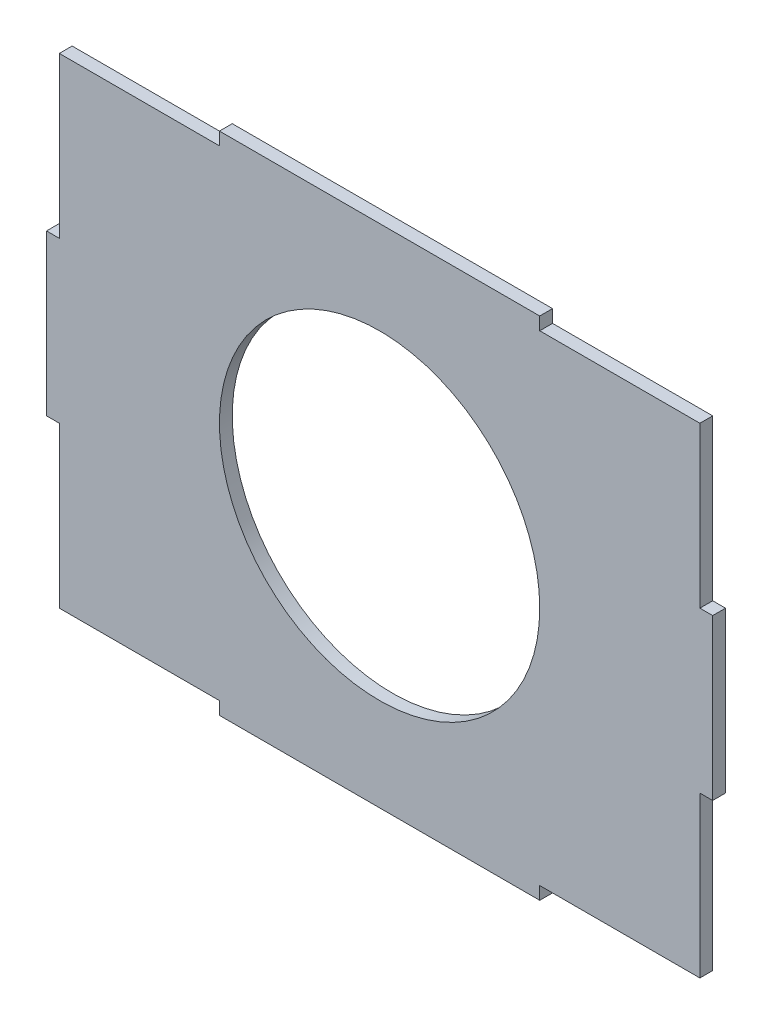
ISO-10303-21;
HEADER;
FILE_DESCRIPTION(('STEP AP214'),'2;1');
FILE_NAME('part.step','',(''),(''),'','','');
FILE_SCHEMA(('AUTOMOTIVE_DESIGN { 1 0 10303 214 1 1 1 1 }'));
ENDSEC;
DATA;
#1=APPLICATION_CONTEXT('core data for automotive mechanical design processes');
#2=APPLICATION_PROTOCOL_DEFINITION('international standard','automotive_design',2000,#1);
#3=PRODUCT_CONTEXT('',#1,'mechanical');
#4=PRODUCT('Part','Part','',(#3));
#5=PRODUCT_RELATED_PRODUCT_CATEGORY('part','',(#4));
#6=PRODUCT_DEFINITION_FORMATION('','',#4);
#7=PRODUCT_DEFINITION_CONTEXT('part definition',#1,'design');
#8=PRODUCT_DEFINITION('design','',#6,#7);
#9=PRODUCT_DEFINITION_SHAPE('','',#8);
#10=(LENGTH_UNIT() NAMED_UNIT(*) SI_UNIT(.MILLI.,.METRE.));
#11=(NAMED_UNIT(*) PLANE_ANGLE_UNIT() SI_UNIT($,.RADIAN.));
#12=(NAMED_UNIT(*) SI_UNIT($,.STERADIAN.) SOLID_ANGLE_UNIT());
#13=UNCERTAINTY_MEASURE_WITH_UNIT(LENGTH_MEASURE(1.E-05),#10,'distance_accuracy_value','');
#14=(GEOMETRIC_REPRESENTATION_CONTEXT(3) GLOBAL_UNCERTAINTY_ASSIGNED_CONTEXT((#13)) GLOBAL_UNIT_ASSIGNED_CONTEXT((#10,
#11,#12)) REPRESENTATION_CONTEXT('',''));
#15=CARTESIAN_POINT('',(0.,0.,0.));
#16=DIRECTION('',(0.,0.,1.));
#17=DIRECTION('',(1.,0.,0.));
#18=AXIS2_PLACEMENT_3D('',#15,#16,#17);
#19=CARTESIAN_POINT('',(0.,0.,4.));
#20=DIRECTION('',(0.,0.,1.));
#21=DIRECTION('',(1.,0.,0.));
#22=AXIS2_PLACEMENT_3D('',#19,#20,#21);
#23=PLANE('',#22);
#24=DIRECTION('',(0.,-1.,0.));
#25=VECTOR('',#24,1.);
#26=CARTESIAN_POINT('',(0.,4.,4.));
#27=LINE('',#26,#25);
#28=CARTESIAN_POINT('',(0.,4.,4.));
#29=VERTEX_POINT('',#28);
#30=CARTESIAN_POINT('',(0.,0.,4.));
#31=VERTEX_POINT('',#30);
#32=EDGE_CURVE('E282',#29,#31,#27,.T.);
#33=ORIENTED_EDGE('',*,*,#32,.T.);
#34=DIRECTION('',(1.,0.,0.));
#35=VECTOR('',#34,1.);
#36=CARTESIAN_POINT('',(0.,0.,4.));
#37=LINE('',#36,#35);
#38=CARTESIAN_POINT('',(100.,0.,4.));
#39=VERTEX_POINT('',#38);
#40=EDGE_CURVE('E146',#31,#39,#37,.T.);
#41=ORIENTED_EDGE('',*,*,#40,.T.);
#42=DIRECTION('',(0.,1.,0.));
#43=VECTOR('',#42,1.);
#44=CARTESIAN_POINT('',(100.,0.,4.));
#45=LINE('',#44,#43);
#46=CARTESIAN_POINT('',(100.,4.,4.));
#47=VERTEX_POINT('',#46);
#48=EDGE_CURVE('E351',#39,#47,#45,.T.);
#49=ORIENTED_EDGE('',*,*,#48,.T.);
#50=DIRECTION('',(1.,0.,0.));
#51=VECTOR('',#50,1.);
#52=CARTESIAN_POINT('',(100.,4.,4.));
#53=LINE('',#52,#51);
#54=CARTESIAN_POINT('',(150.,4.,4.));
#55=VERTEX_POINT('',#54);
#56=EDGE_CURVE('E371',#47,#55,#53,.T.);
#57=ORIENTED_EDGE('',*,*,#56,.T.);
#58=DIRECTION('',(0.,1.,0.));
#59=VECTOR('',#58,1.);
#60=CARTESIAN_POINT('',(150.,4.,4.));
#61=LINE('',#60,#59);
#62=CARTESIAN_POINT('',(150.,54.,4.));
#63=VERTEX_POINT('',#62);
#64=EDGE_CURVE('E367',#55,#63,#61,.T.);
#65=ORIENTED_EDGE('',*,*,#64,.T.);
#66=DIRECTION('',(1.,0.,0.));
#67=VECTOR('',#66,1.);
#68=CARTESIAN_POINT('',(150.,54.,4.));
#69=LINE('',#68,#67);
#70=CARTESIAN_POINT('',(154.,54.,4.));
#71=VERTEX_POINT('',#70);
#72=EDGE_CURVE('E370',#63,#71,#69,.T.);
#73=ORIENTED_EDGE('',*,*,#72,.T.);
#74=DIRECTION('',(0.,1.,0.));
#75=VECTOR('',#74,1.);
#76=CARTESIAN_POINT('',(154.,54.,4.));
#77=LINE('',#76,#75);
#78=CARTESIAN_POINT('',(154.,104.,4.));
#79=VERTEX_POINT('',#78);
#80=EDGE_CURVE('E375',#71,#79,#77,.T.);
#81=ORIENTED_EDGE('',*,*,#80,.T.);
#82=DIRECTION('',(-1.,0.,0.));
#83=VECTOR('',#82,1.);
#84=CARTESIAN_POINT('',(154.,104.,4.));
#85=LINE('',#84,#83);
#86=CARTESIAN_POINT('',(150.,104.,4.));
#87=VERTEX_POINT('',#86);
#88=EDGE_CURVE('E382',#79,#87,#85,.T.);
#89=ORIENTED_EDGE('',*,*,#88,.T.);
#90=DIRECTION('',(0.,1.,0.));
#91=VECTOR('',#90,1.);
#92=CARTESIAN_POINT('',(150.,104.,4.));
#93=LINE('',#92,#91);
#94=CARTESIAN_POINT('',(150.,154.,4.));
#95=VERTEX_POINT('',#94);
#96=EDGE_CURVE('E385',#87,#95,#93,.T.);
#97=ORIENTED_EDGE('',*,*,#96,.T.);
#98=DIRECTION('',(-1.,0.,0.));
#99=VECTOR('',#98,1.);
#100=CARTESIAN_POINT('',(150.,154.,4.));
#101=LINE('',#100,#99);
#102=CARTESIAN_POINT('',(100.,154.,4.));
#103=VERTEX_POINT('',#102);
#104=EDGE_CURVE('E388',#95,#103,#101,.T.);
#105=ORIENTED_EDGE('',*,*,#104,.T.);
#106=DIRECTION('',(0.,1.,0.));
#107=VECTOR('',#106,1.);
#108=CARTESIAN_POINT('',(100.,154.,4.));
#109=LINE('',#108,#107);
#110=CARTESIAN_POINT('',(100.,158.,4.));
#111=VERTEX_POINT('',#110);
#112=EDGE_CURVE('E391',#103,#111,#109,.T.);
#113=ORIENTED_EDGE('',*,*,#112,.T.);
#114=DIRECTION('',(-1.,0.,0.));
#115=VECTOR('',#114,1.);
#116=CARTESIAN_POINT('',(100.,158.,4.));
#117=LINE('',#116,#115);
#118=CARTESIAN_POINT('',(0.,158.,4.));
#119=VERTEX_POINT('',#118);
#120=EDGE_CURVE('E394',#111,#119,#117,.T.);
#121=ORIENTED_EDGE('',*,*,#120,.T.);
#122=DIRECTION('',(0.,-1.,0.));
#123=VECTOR('',#122,1.);
#124=CARTESIAN_POINT('',(0.,158.,4.));
#125=LINE('',#124,#123);
#126=CARTESIAN_POINT('',(0.,154.,4.));
#127=VERTEX_POINT('',#126);
#128=EDGE_CURVE('E397',#119,#127,#125,.T.);
#129=ORIENTED_EDGE('',*,*,#128,.T.);
#130=DIRECTION('',(-1.,0.,0.));
#131=VECTOR('',#130,1.);
#132=CARTESIAN_POINT('',(0.,154.,4.));
#133=LINE('',#132,#131);
#134=CARTESIAN_POINT('',(-50.,154.,4.));
#135=VERTEX_POINT('',#134);
#136=EDGE_CURVE('E400',#127,#135,#133,.T.);
#137=ORIENTED_EDGE('',*,*,#136,.T.);
#138=DIRECTION('',(0.,-1.,0.));
#139=VECTOR('',#138,1.);
#140=CARTESIAN_POINT('',(-50.,154.,4.));
#141=LINE('',#140,#139);
#142=CARTESIAN_POINT('',(-50.,104.,4.));
#143=VERTEX_POINT('',#142);
#144=EDGE_CURVE('E403',#135,#143,#141,.T.);
#145=ORIENTED_EDGE('',*,*,#144,.T.);
#146=DIRECTION('',(-1.,0.,0.));
#147=VECTOR('',#146,1.);
#148=CARTESIAN_POINT('',(-50.,104.,4.));
#149=LINE('',#148,#147);
#150=CARTESIAN_POINT('',(-54.,104.,4.));
#151=VERTEX_POINT('',#150);
#152=EDGE_CURVE('E406',#143,#151,#149,.T.);
#153=ORIENTED_EDGE('',*,*,#152,.T.);
#154=DIRECTION('',(0.,-1.,0.));
#155=VECTOR('',#154,1.);
#156=CARTESIAN_POINT('',(-54.,104.,4.));
#157=LINE('',#156,#155);
#158=CARTESIAN_POINT('',(-54.,54.,4.));
#159=VERTEX_POINT('',#158);
#160=EDGE_CURVE('E201',#151,#159,#157,.T.);
#161=ORIENTED_EDGE('',*,*,#160,.T.);
#162=DIRECTION('',(1.,0.,0.));
#163=VECTOR('',#162,1.);
#164=CARTESIAN_POINT('',(-54.,54.,4.));
#165=LINE('',#164,#163);
#166=CARTESIAN_POINT('',(-50.,54.,4.));
#167=VERTEX_POINT('',#166);
#168=EDGE_CURVE('E195',#159,#167,#165,.T.);
#169=ORIENTED_EDGE('',*,*,#168,.T.);
#170=DIRECTION('',(0.,-1.,0.));
#171=VECTOR('',#170,1.);
#172=CARTESIAN_POINT('',(-50.,54.,4.));
#173=LINE('',#172,#171);
#174=CARTESIAN_POINT('',(-50.,4.,4.));
#175=VERTEX_POINT('',#174);
#176=EDGE_CURVE('E199',#167,#175,#173,.T.);
#177=ORIENTED_EDGE('',*,*,#176,.T.);
#178=DIRECTION('',(1.,0.,0.));
#179=VECTOR('',#178,1.);
#180=CARTESIAN_POINT('',(-50.,4.,4.));
#181=LINE('',#180,#179);
#182=EDGE_CURVE('E67',#175,#29,#181,.T.);
#183=ORIENTED_EDGE('',*,*,#182,.T.);
#184=EDGE_LOOP('',(#33,#41,#49,#57,#65,#73,#81,#89,#97,#105,#113,#121,#129,#137,#145,#153,#161,
#169,#177,#183));
#185=FACE_BOUND('',#184,.T.);
#186=CARTESIAN_POINT('',(50.,79.,4.));
#187=DIRECTION('',(0.,0.,1.));
#188=DIRECTION('',(1.,0.,0.));
#189=AXIS2_PLACEMENT_3D('',#186,#187,#188);
#190=CIRCLE('',#189,50.);
#191=CARTESIAN_POINT('',(100.,79.,4.));
#192=VERTEX_POINT('',#191);
#193=EDGE_CURVE('E228',#192,#192,#190,.T.);
#194=ORIENTED_EDGE('',*,*,#193,.F.);
#195=EDGE_LOOP('',(#194));
#196=FACE_BOUND('',#195,.T.);
#197=ADVANCED_FACE('F49',(#185,#196),#23,.T.);
#198=CARTESIAN_POINT('',(0.,0.,0.));
#199=DIRECTION('',(0.,0.,1.));
#200=DIRECTION('',(1.,0.,0.));
#201=AXIS2_PLACEMENT_3D('',#198,#199,#200);
#202=PLANE('',#201);
#203=DIRECTION('',(0.,-1.,0.));
#204=VECTOR('',#203,1.);
#205=CARTESIAN_POINT('',(0.,4.,0.));
#206=LINE('',#205,#204);
#207=CARTESIAN_POINT('',(0.,4.,0.));
#208=VERTEX_POINT('',#207);
#209=CARTESIAN_POINT('',(0.,0.,0.));
#210=VERTEX_POINT('',#209);
#211=EDGE_CURVE('E223',#208,#210,#206,.T.);
#212=ORIENTED_EDGE('',*,*,#211,.F.);
#213=DIRECTION('',(1.,0.,0.));
#214=VECTOR('',#213,1.);
#215=CARTESIAN_POINT('',(-50.,4.,0.));
#216=LINE('',#215,#214);
#217=CARTESIAN_POINT('',(-50.,4.,0.));
#218=VERTEX_POINT('',#217);
#219=EDGE_CURVE('E138',#218,#208,#216,.T.);
#220=ORIENTED_EDGE('',*,*,#219,.F.);
#221=DIRECTION('',(0.,-1.,0.));
#222=VECTOR('',#221,1.);
#223=CARTESIAN_POINT('',(-50.,54.,0.));
#224=LINE('',#223,#222);
#225=CARTESIAN_POINT('',(-50.,54.,0.));
#226=VERTEX_POINT('',#225);
#227=EDGE_CURVE('E132',#226,#218,#224,.T.);
#228=ORIENTED_EDGE('',*,*,#227,.F.);
#229=DIRECTION('',(1.,0.,0.));
#230=VECTOR('',#229,1.);
#231=CARTESIAN_POINT('',(-54.,54.,0.));
#232=LINE('',#231,#230);
#233=CARTESIAN_POINT('',(-54.,54.,0.));
#234=VERTEX_POINT('',#233);
#235=EDGE_CURVE('E210',#234,#226,#232,.T.);
#236=ORIENTED_EDGE('',*,*,#235,.F.);
#237=DIRECTION('',(0.,-1.,0.));
#238=VECTOR('',#237,1.);
#239=CARTESIAN_POINT('',(-54.,104.,0.));
#240=LINE('',#239,#238);
#241=CARTESIAN_POINT('',(-54.,104.,0.));
#242=VERTEX_POINT('',#241);
#243=EDGE_CURVE('E273',#242,#234,#240,.T.);
#244=ORIENTED_EDGE('',*,*,#243,.F.);
#245=DIRECTION('',(-1.,0.,0.));
#246=VECTOR('',#245,1.);
#247=CARTESIAN_POINT('',(-50.,104.,0.));
#248=LINE('',#247,#246);
#249=CARTESIAN_POINT('',(-50.,104.,0.));
#250=VERTEX_POINT('',#249);
#251=EDGE_CURVE('E270',#250,#242,#248,.T.);
#252=ORIENTED_EDGE('',*,*,#251,.F.);
#253=DIRECTION('',(0.,-1.,0.));
#254=VECTOR('',#253,1.);
#255=CARTESIAN_POINT('',(-50.,154.,0.));
#256=LINE('',#255,#254);
#257=CARTESIAN_POINT('',(-50.,154.,0.));
#258=VERTEX_POINT('',#257);
#259=EDGE_CURVE('E267',#258,#250,#256,.T.);
#260=ORIENTED_EDGE('',*,*,#259,.F.);
#261=DIRECTION('',(-1.,0.,0.));
#262=VECTOR('',#261,1.);
#263=CARTESIAN_POINT('',(0.,154.,0.));
#264=LINE('',#263,#262);
#265=CARTESIAN_POINT('',(0.,154.,0.));
#266=VERTEX_POINT('',#265);
#267=EDGE_CURVE('E264',#266,#258,#264,.T.);
#268=ORIENTED_EDGE('',*,*,#267,.F.);
#269=DIRECTION('',(0.,-1.,0.));
#270=VECTOR('',#269,1.);
#271=CARTESIAN_POINT('',(0.,158.,0.));
#272=LINE('',#271,#270);
#273=CARTESIAN_POINT('',(0.,158.,0.));
#274=VERTEX_POINT('',#273);
#275=EDGE_CURVE('E261',#274,#266,#272,.T.);
#276=ORIENTED_EDGE('',*,*,#275,.F.);
#277=DIRECTION('',(-1.,0.,0.));
#278=VECTOR('',#277,1.);
#279=CARTESIAN_POINT('',(100.,158.,0.));
#280=LINE('',#279,#278);
#281=CARTESIAN_POINT('',(100.,158.,0.));
#282=VERTEX_POINT('',#281);
#283=EDGE_CURVE('E258',#282,#274,#280,.T.);
#284=ORIENTED_EDGE('',*,*,#283,.F.);
#285=DIRECTION('',(0.,1.,0.));
#286=VECTOR('',#285,1.);
#287=CARTESIAN_POINT('',(100.,154.,0.));
#288=LINE('',#287,#286);
#289=CARTESIAN_POINT('',(100.,154.,0.));
#290=VERTEX_POINT('',#289);
#291=EDGE_CURVE('E255',#290,#282,#288,.T.);
#292=ORIENTED_EDGE('',*,*,#291,.F.);
#293=DIRECTION('',(-1.,0.,0.));
#294=VECTOR('',#293,1.);
#295=CARTESIAN_POINT('',(150.,154.,0.));
#296=LINE('',#295,#294);
#297=CARTESIAN_POINT('',(150.,154.,0.));
#298=VERTEX_POINT('',#297);
#299=EDGE_CURVE('E252',#298,#290,#296,.T.);
#300=ORIENTED_EDGE('',*,*,#299,.F.);
#301=DIRECTION('',(0.,1.,0.));
#302=VECTOR('',#301,1.);
#303=CARTESIAN_POINT('',(150.,104.,0.));
#304=LINE('',#303,#302);
#305=CARTESIAN_POINT('',(150.,104.,0.));
#306=VERTEX_POINT('',#305);
#307=EDGE_CURVE('E249',#306,#298,#304,.T.);
#308=ORIENTED_EDGE('',*,*,#307,.F.);
#309=DIRECTION('',(-1.,0.,0.));
#310=VECTOR('',#309,1.);
#311=CARTESIAN_POINT('',(154.,104.,0.));
#312=LINE('',#311,#310);
#313=CARTESIAN_POINT('',(154.,104.,0.));
#314=VERTEX_POINT('',#313);
#315=EDGE_CURVE('E246',#314,#306,#312,.T.);
#316=ORIENTED_EDGE('',*,*,#315,.F.);
#317=DIRECTION('',(0.,1.,0.));
#318=VECTOR('',#317,1.);
#319=CARTESIAN_POINT('',(154.,54.,0.));
#320=LINE('',#319,#318);
#321=CARTESIAN_POINT('',(154.,54.,0.));
#322=VERTEX_POINT('',#321);
#323=EDGE_CURVE('E243',#322,#314,#320,.T.);
#324=ORIENTED_EDGE('',*,*,#323,.F.);
#325=DIRECTION('',(1.,0.,0.));
#326=VECTOR('',#325,1.);
#327=CARTESIAN_POINT('',(150.,54.,0.));
#328=LINE('',#327,#326);
#329=CARTESIAN_POINT('',(150.,54.,0.));
#330=VERTEX_POINT('',#329);
#331=EDGE_CURVE('E240',#330,#322,#328,.T.);
#332=ORIENTED_EDGE('',*,*,#331,.F.);
#333=DIRECTION('',(0.,1.,0.));
#334=VECTOR('',#333,1.);
#335=CARTESIAN_POINT('',(150.,4.,0.));
#336=LINE('',#335,#334);
#337=CARTESIAN_POINT('',(150.,4.,0.));
#338=VERTEX_POINT('',#337);
#339=EDGE_CURVE('E237',#338,#330,#336,.T.);
#340=ORIENTED_EDGE('',*,*,#339,.F.);
#341=DIRECTION('',(1.,0.,0.));
#342=VECTOR('',#341,1.);
#343=CARTESIAN_POINT('',(100.,4.,0.));
#344=LINE('',#343,#342);
#345=CARTESIAN_POINT('',(100.,4.,0.));
#346=VERTEX_POINT('',#345);
#347=EDGE_CURVE('E234',#346,#338,#344,.T.);
#348=ORIENTED_EDGE('',*,*,#347,.F.);
#349=DIRECTION('',(0.,1.,0.));
#350=VECTOR('',#349,1.);
#351=CARTESIAN_POINT('',(100.,0.,0.));
#352=LINE('',#351,#350);
#353=CARTESIAN_POINT('',(100.,0.,0.));
#354=VERTEX_POINT('',#353);
#355=EDGE_CURVE('E231',#354,#346,#352,.T.);
#356=ORIENTED_EDGE('',*,*,#355,.F.);
#357=DIRECTION('',(1.,0.,0.));
#358=VECTOR('',#357,1.);
#359=CARTESIAN_POINT('',(0.,0.,0.));
#360=LINE('',#359,#358);
#361=EDGE_CURVE('E227',#210,#354,#360,.T.);
#362=ORIENTED_EDGE('',*,*,#361,.F.);
#363=EDGE_LOOP('',(#212,#220,#228,#236,#244,#252,#260,#268,#276,#284,#292,#300,#308,#316,#324,
#332,#340,#348,#356,#362));
#364=FACE_BOUND('',#363,.T.);
#365=CARTESIAN_POINT('',(50.,79.,0.));
#366=DIRECTION('',(0.,0.,1.));
#367=DIRECTION('',(1.,0.,0.));
#368=AXIS2_PLACEMENT_3D('',#365,#366,#367);
#369=CIRCLE('',#368,50.);
#370=CARTESIAN_POINT('',(100.,79.,0.));
#371=VERTEX_POINT('',#370);
#372=EDGE_CURVE('E751',#371,#371,#369,.T.);
#373=ORIENTED_EDGE('',*,*,#372,.T.);
#374=EDGE_LOOP('',(#373));
#375=FACE_BOUND('',#374,.T.);
#376=ADVANCED_FACE('F355',(#364,#375),#202,.F.);
#377=CARTESIAN_POINT('',(0.,4.,4.));
#378=DIRECTION('',(1.,0.,0.));
#379=DIRECTION('',(0.,0.,-1.));
#380=AXIS2_PLACEMENT_3D('',#377,#378,#379);
#381=PLANE('',#380);
#382=ORIENTED_EDGE('',*,*,#211,.T.);
#383=DIRECTION('',(0.,0.,-1.));
#384=VECTOR('',#383,1.);
#385=CARTESIAN_POINT('',(0.,0.,4.));
#386=LINE('',#385,#384);
#387=EDGE_CURVE('E11',#31,#210,#386,.T.);
#388=ORIENTED_EDGE('',*,*,#387,.F.);
#389=ORIENTED_EDGE('',*,*,#32,.F.);
#390=DIRECTION('',(0.,0.,-1.));
#391=VECTOR('',#390,1.);
#392=CARTESIAN_POINT('',(0.,4.,4.));
#393=LINE('',#392,#391);
#394=EDGE_CURVE('E219',#29,#208,#393,.T.);
#395=ORIENTED_EDGE('',*,*,#394,.T.);
#396=EDGE_LOOP('',(#382,#388,#389,#395));
#397=FACE_BOUND('',#396,.T.);
#398=ADVANCED_FACE('F51',(#397),#381,.F.);
#399=CARTESIAN_POINT('',(0.,0.,4.));
#400=DIRECTION('',(0.,1.,0.));
#401=DIRECTION('',(0.,0.,1.));
#402=AXIS2_PLACEMENT_3D('',#399,#400,#401);
#403=PLANE('',#402);
#404=ORIENTED_EDGE('',*,*,#361,.T.);
#405=DIRECTION('',(0.,0.,-1.));
#406=VECTOR('',#405,1.);
#407=CARTESIAN_POINT('',(100.,0.,4.));
#408=LINE('',#407,#406);
#409=EDGE_CURVE('E59',#39,#354,#408,.T.);
#410=ORIENTED_EDGE('',*,*,#409,.F.);
#411=ORIENTED_EDGE('',*,*,#40,.F.);
#412=ORIENTED_EDGE('',*,*,#387,.T.);
#413=EDGE_LOOP('',(#404,#410,#411,#412));
#414=FACE_BOUND('',#413,.T.);
#415=ADVANCED_FACE('F442',(#414),#403,.F.);
#416=CARTESIAN_POINT('',(100.,0.,4.));
#417=DIRECTION('',(-1.,0.,0.));
#418=DIRECTION('',(0.,0.,1.));
#419=AXIS2_PLACEMENT_3D('',#416,#417,#418);
#420=PLANE('',#419);
#421=ORIENTED_EDGE('',*,*,#355,.T.);
#422=DIRECTION('',(0.,0.,-1.));
#423=VECTOR('',#422,1.);
#424=CARTESIAN_POINT('',(100.,4.,4.));
#425=LINE('',#424,#423);
#426=EDGE_CURVE('E341',#47,#346,#425,.T.);
#427=ORIENTED_EDGE('',*,*,#426,.F.);
#428=ORIENTED_EDGE('',*,*,#48,.F.);
#429=ORIENTED_EDGE('',*,*,#409,.T.);
#430=EDGE_LOOP('',(#421,#427,#428,#429));
#431=FACE_BOUND('',#430,.T.);
#432=ADVANCED_FACE('F349',(#431),#420,.F.);
#433=CARTESIAN_POINT('',(100.,4.,4.));
#434=DIRECTION('',(0.,1.,0.));
#435=DIRECTION('',(0.,0.,1.));
#436=AXIS2_PLACEMENT_3D('',#433,#434,#435);
#437=PLANE('',#436);
#438=ORIENTED_EDGE('',*,*,#347,.T.);
#439=DIRECTION('',(0.,0.,-1.));
#440=VECTOR('',#439,1.);
#441=CARTESIAN_POINT('',(150.,4.,4.));
#442=LINE('',#441,#440);
#443=EDGE_CURVE('E337',#55,#338,#442,.T.);
#444=ORIENTED_EDGE('',*,*,#443,.F.);
#445=ORIENTED_EDGE('',*,*,#56,.F.);
#446=ORIENTED_EDGE('',*,*,#426,.T.);
#447=EDGE_LOOP('',(#438,#444,#445,#446));
#448=FACE_BOUND('',#447,.T.);
#449=ADVANCED_FACE('F361',(#448),#437,.F.);
#450=CARTESIAN_POINT('',(150.,4.,4.));
#451=DIRECTION('',(-1.,0.,0.));
#452=DIRECTION('',(0.,0.,1.));
#453=AXIS2_PLACEMENT_3D('',#450,#451,#452);
#454=PLANE('',#453);
#455=ORIENTED_EDGE('',*,*,#339,.T.);
#456=DIRECTION('',(0.,0.,-1.));
#457=VECTOR('',#456,1.);
#458=CARTESIAN_POINT('',(150.,54.,4.));
#459=LINE('',#458,#457);
#460=EDGE_CURVE('E333',#63,#330,#459,.T.);
#461=ORIENTED_EDGE('',*,*,#460,.F.);
#462=ORIENTED_EDGE('',*,*,#64,.F.);
#463=ORIENTED_EDGE('',*,*,#443,.T.);
#464=EDGE_LOOP('',(#455,#461,#462,#463));
#465=FACE_BOUND('',#464,.T.);
#466=ADVANCED_FACE('F365',(#465),#454,.F.);
#467=CARTESIAN_POINT('',(150.,54.,4.));
#468=DIRECTION('',(0.,1.,0.));
#469=DIRECTION('',(0.,0.,1.));
#470=AXIS2_PLACEMENT_3D('',#467,#468,#469);
#471=PLANE('',#470);
#472=ORIENTED_EDGE('',*,*,#331,.T.);
#473=DIRECTION('',(0.,0.,-1.));
#474=VECTOR('',#473,1.);
#475=CARTESIAN_POINT('',(154.,54.,4.));
#476=LINE('',#475,#474);
#477=EDGE_CURVE('E329',#71,#322,#476,.T.);
#478=ORIENTED_EDGE('',*,*,#477,.F.);
#479=ORIENTED_EDGE('',*,*,#72,.F.);
#480=ORIENTED_EDGE('',*,*,#460,.T.);
#481=EDGE_LOOP('',(#472,#478,#479,#480));
#482=FACE_BOUND('',#481,.T.);
#483=ADVANCED_FACE('F455',(#482),#471,.F.);
#484=CARTESIAN_POINT('',(154.,54.,4.));
#485=DIRECTION('',(-1.,0.,0.));
#486=DIRECTION('',(0.,0.,1.));
#487=AXIS2_PLACEMENT_3D('',#484,#485,#486);
#488=PLANE('',#487);
#489=ORIENTED_EDGE('',*,*,#323,.T.);
#490=DIRECTION('',(0.,0.,-1.));
#491=VECTOR('',#490,1.);
#492=CARTESIAN_POINT('',(154.,104.,4.));
#493=LINE('',#492,#491);
#494=EDGE_CURVE('E325',#79,#314,#493,.T.);
#495=ORIENTED_EDGE('',*,*,#494,.F.);
#496=ORIENTED_EDGE('',*,*,#80,.F.);
#497=ORIENTED_EDGE('',*,*,#477,.T.);
#498=EDGE_LOOP('',(#489,#495,#496,#497));
#499=FACE_BOUND('',#498,.T.);
#500=ADVANCED_FACE('F458',(#499),#488,.F.);
#501=CARTESIAN_POINT('',(154.,104.,4.));
#502=DIRECTION('',(0.,-1.,0.));
#503=DIRECTION('',(0.,0.,-1.));
#504=AXIS2_PLACEMENT_3D('',#501,#502,#503);
#505=PLANE('',#504);
#506=ORIENTED_EDGE('',*,*,#315,.T.);
#507=DIRECTION('',(0.,0.,-1.));
#508=VECTOR('',#507,1.);
#509=CARTESIAN_POINT('',(150.,104.,4.));
#510=LINE('',#509,#508);
#511=EDGE_CURVE('E321',#87,#306,#510,.T.);
#512=ORIENTED_EDGE('',*,*,#511,.F.);
#513=ORIENTED_EDGE('',*,*,#88,.F.);
#514=ORIENTED_EDGE('',*,*,#494,.T.);
#515=EDGE_LOOP('',(#506,#512,#513,#514));
#516=FACE_BOUND('',#515,.T.);
#517=ADVANCED_FACE('F462',(#516),#505,.F.);
#518=CARTESIAN_POINT('',(150.,104.,4.));
#519=DIRECTION('',(-1.,0.,0.));
#520=DIRECTION('',(0.,0.,1.));
#521=AXIS2_PLACEMENT_3D('',#518,#519,#520);
#522=PLANE('',#521);
#523=ORIENTED_EDGE('',*,*,#307,.T.);
#524=DIRECTION('',(0.,0.,-1.));
#525=VECTOR('',#524,1.);
#526=CARTESIAN_POINT('',(150.,154.,4.));
#527=LINE('',#526,#525);
#528=EDGE_CURVE('E317',#95,#298,#527,.T.);
#529=ORIENTED_EDGE('',*,*,#528,.F.);
#530=ORIENTED_EDGE('',*,*,#96,.F.);
#531=ORIENTED_EDGE('',*,*,#511,.T.);
#532=EDGE_LOOP('',(#523,#529,#530,#531));
#533=FACE_BOUND('',#532,.T.);
#534=ADVANCED_FACE('F466',(#533),#522,.F.);
#535=CARTESIAN_POINT('',(150.,154.,4.));
#536=DIRECTION('',(0.,-1.,0.));
#537=DIRECTION('',(0.,0.,-1.));
#538=AXIS2_PLACEMENT_3D('',#535,#536,#537);
#539=PLANE('',#538);
#540=ORIENTED_EDGE('',*,*,#299,.T.);
#541=DIRECTION('',(0.,0.,-1.));
#542=VECTOR('',#541,1.);
#543=CARTESIAN_POINT('',(100.,154.,4.));
#544=LINE('',#543,#542);
#545=EDGE_CURVE('E313',#103,#290,#544,.T.);
#546=ORIENTED_EDGE('',*,*,#545,.F.);
#547=ORIENTED_EDGE('',*,*,#104,.F.);
#548=ORIENTED_EDGE('',*,*,#528,.T.);
#549=EDGE_LOOP('',(#540,#546,#547,#548));
#550=FACE_BOUND('',#549,.T.);
#551=ADVANCED_FACE('F470',(#550),#539,.F.);
#552=CARTESIAN_POINT('',(100.,154.,4.));
#553=DIRECTION('',(-1.,0.,0.));
#554=DIRECTION('',(0.,0.,1.));
#555=AXIS2_PLACEMENT_3D('',#552,#553,#554);
#556=PLANE('',#555);
#557=ORIENTED_EDGE('',*,*,#291,.T.);
#558=DIRECTION('',(0.,0.,-1.));
#559=VECTOR('',#558,1.);
#560=CARTESIAN_POINT('',(100.,158.,4.));
#561=LINE('',#560,#559);
#562=EDGE_CURVE('E309',#111,#282,#561,.T.);
#563=ORIENTED_EDGE('',*,*,#562,.F.);
#564=ORIENTED_EDGE('',*,*,#112,.F.);
#565=ORIENTED_EDGE('',*,*,#545,.T.);
#566=EDGE_LOOP('',(#557,#563,#564,#565));
#567=FACE_BOUND('',#566,.T.);
#568=ADVANCED_FACE('F474',(#567),#556,.F.);
#569=CARTESIAN_POINT('',(100.,158.,4.));
#570=DIRECTION('',(0.,-1.,0.));
#571=DIRECTION('',(0.,0.,-1.));
#572=AXIS2_PLACEMENT_3D('',#569,#570,#571);
#573=PLANE('',#572);
#574=ORIENTED_EDGE('',*,*,#283,.T.);
#575=DIRECTION('',(0.,0.,-1.));
#576=VECTOR('',#575,1.);
#577=CARTESIAN_POINT('',(0.,158.,4.));
#578=LINE('',#577,#576);
#579=EDGE_CURVE('E305',#119,#274,#578,.T.);
#580=ORIENTED_EDGE('',*,*,#579,.F.);
#581=ORIENTED_EDGE('',*,*,#120,.F.);
#582=ORIENTED_EDGE('',*,*,#562,.T.);
#583=EDGE_LOOP('',(#574,#580,#581,#582));
#584=FACE_BOUND('',#583,.T.);
#585=ADVANCED_FACE('F478',(#584),#573,.F.);
#586=CARTESIAN_POINT('',(0.,158.,4.));
#587=DIRECTION('',(1.,0.,0.));
#588=DIRECTION('',(0.,0.,-1.));
#589=AXIS2_PLACEMENT_3D('',#586,#587,#588);
#590=PLANE('',#589);
#591=ORIENTED_EDGE('',*,*,#275,.T.);
#592=DIRECTION('',(0.,0.,-1.));
#593=VECTOR('',#592,1.);
#594=CARTESIAN_POINT('',(0.,154.,4.));
#595=LINE('',#594,#593);
#596=EDGE_CURVE('E301',#127,#266,#595,.T.);
#597=ORIENTED_EDGE('',*,*,#596,.F.);
#598=ORIENTED_EDGE('',*,*,#128,.F.);
#599=ORIENTED_EDGE('',*,*,#579,.T.);
#600=EDGE_LOOP('',(#591,#597,#598,#599));
#601=FACE_BOUND('',#600,.T.);
#602=ADVANCED_FACE('F482',(#601),#590,.F.);
#603=CARTESIAN_POINT('',(0.,154.,4.));
#604=DIRECTION('',(0.,-1.,0.));
#605=DIRECTION('',(0.,0.,-1.));
#606=AXIS2_PLACEMENT_3D('',#603,#604,#605);
#607=PLANE('',#606);
#608=ORIENTED_EDGE('',*,*,#267,.T.);
#609=DIRECTION('',(0.,0.,-1.));
#610=VECTOR('',#609,1.);
#611=CARTESIAN_POINT('',(-50.,154.,4.));
#612=LINE('',#611,#610);
#613=EDGE_CURVE('E297',#135,#258,#612,.T.);
#614=ORIENTED_EDGE('',*,*,#613,.F.);
#615=ORIENTED_EDGE('',*,*,#136,.F.);
#616=ORIENTED_EDGE('',*,*,#596,.T.);
#617=EDGE_LOOP('',(#608,#614,#615,#616));
#618=FACE_BOUND('',#617,.T.);
#619=ADVANCED_FACE('F486',(#618),#607,.F.);
#620=CARTESIAN_POINT('',(-50.,154.,4.));
#621=DIRECTION('',(1.,0.,0.));
#622=DIRECTION('',(0.,0.,-1.));
#623=AXIS2_PLACEMENT_3D('',#620,#621,#622);
#624=PLANE('',#623);
#625=ORIENTED_EDGE('',*,*,#259,.T.);
#626=DIRECTION('',(0.,0.,-1.));
#627=VECTOR('',#626,1.);
#628=CARTESIAN_POINT('',(-50.,104.,4.));
#629=LINE('',#628,#627);
#630=EDGE_CURVE('E293',#143,#250,#629,.T.);
#631=ORIENTED_EDGE('',*,*,#630,.F.);
#632=ORIENTED_EDGE('',*,*,#144,.F.);
#633=ORIENTED_EDGE('',*,*,#613,.T.);
#634=EDGE_LOOP('',(#625,#631,#632,#633));
#635=FACE_BOUND('',#634,.T.);
#636=ADVANCED_FACE('F490',(#635),#624,.F.);
#637=CARTESIAN_POINT('',(-50.,104.,4.));
#638=DIRECTION('',(0.,-1.,0.));
#639=DIRECTION('',(0.,0.,-1.));
#640=AXIS2_PLACEMENT_3D('',#637,#638,#639);
#641=PLANE('',#640);
#642=ORIENTED_EDGE('',*,*,#251,.T.);
#643=DIRECTION('',(0.,0.,-1.));
#644=VECTOR('',#643,1.);
#645=CARTESIAN_POINT('',(-54.,104.,4.));
#646=LINE('',#645,#644);
#647=EDGE_CURVE('E289',#151,#242,#646,.T.);
#648=ORIENTED_EDGE('',*,*,#647,.F.);
#649=ORIENTED_EDGE('',*,*,#152,.F.);
#650=ORIENTED_EDGE('',*,*,#630,.T.);
#651=EDGE_LOOP('',(#642,#648,#649,#650));
#652=FACE_BOUND('',#651,.T.);
#653=ADVANCED_FACE('F414',(#652),#641,.F.);
#654=CARTESIAN_POINT('',(-54.,104.,4.));
#655=DIRECTION('',(1.,0.,0.));
#656=DIRECTION('',(0.,0.,-1.));
#657=AXIS2_PLACEMENT_3D('',#654,#655,#656);
#658=PLANE('',#657);
#659=ORIENTED_EDGE('',*,*,#243,.T.);
#660=DIRECTION('',(0.,0.,-1.));
#661=VECTOR('',#660,1.);
#662=CARTESIAN_POINT('',(-54.,54.,4.));
#663=LINE('',#662,#661);
#664=EDGE_CURVE('E212',#159,#234,#663,.T.);
#665=ORIENTED_EDGE('',*,*,#664,.F.);
#666=ORIENTED_EDGE('',*,*,#160,.F.);
#667=ORIENTED_EDGE('',*,*,#647,.T.);
#668=EDGE_LOOP('',(#659,#665,#666,#667));
#669=FACE_BOUND('',#668,.T.);
#670=ADVANCED_FACE('F418',(#669),#658,.F.);
#671=CARTESIAN_POINT('',(-54.,54.,4.));
#672=DIRECTION('',(0.,1.,0.));
#673=DIRECTION('',(0.,0.,1.));
#674=AXIS2_PLACEMENT_3D('',#671,#672,#673);
#675=PLANE('',#674);
#676=ORIENTED_EDGE('',*,*,#235,.T.);
#677=DIRECTION('',(0.,0.,-1.));
#678=VECTOR('',#677,1.);
#679=CARTESIAN_POINT('',(-50.,54.,4.));
#680=LINE('',#679,#678);
#681=EDGE_CURVE('E207',#167,#226,#680,.T.);
#682=ORIENTED_EDGE('',*,*,#681,.F.);
#683=ORIENTED_EDGE('',*,*,#168,.F.);
#684=ORIENTED_EDGE('',*,*,#664,.T.);
#685=EDGE_LOOP('',(#676,#682,#683,#684));
#686=FACE_BOUND('',#685,.T.);
#687=ADVANCED_FACE('F208',(#686),#675,.F.);
#688=CARTESIAN_POINT('',(-50.,54.,4.));
#689=DIRECTION('',(1.,0.,0.));
#690=DIRECTION('',(0.,0.,-1.));
#691=AXIS2_PLACEMENT_3D('',#688,#689,#690);
#692=PLANE('',#691);
#693=ORIENTED_EDGE('',*,*,#227,.T.);
#694=DIRECTION('',(0.,0.,-1.));
#695=VECTOR('',#694,1.);
#696=CARTESIAN_POINT('',(-50.,4.,4.));
#697=LINE('',#696,#695);
#698=EDGE_CURVE('E213',#175,#218,#697,.T.);
#699=ORIENTED_EDGE('',*,*,#698,.F.);
#700=ORIENTED_EDGE('',*,*,#176,.F.);
#701=ORIENTED_EDGE('',*,*,#681,.T.);
#702=EDGE_LOOP('',(#693,#699,#700,#701));
#703=FACE_BOUND('',#702,.T.);
#704=ADVANCED_FACE('F215',(#703),#692,.F.);
#705=CARTESIAN_POINT('',(-50.,4.,4.));
#706=DIRECTION('',(0.,1.,0.));
#707=DIRECTION('',(0.,0.,1.));
#708=AXIS2_PLACEMENT_3D('',#705,#706,#707);
#709=PLANE('',#708);
#710=ORIENTED_EDGE('',*,*,#219,.T.);
#711=ORIENTED_EDGE('',*,*,#394,.F.);
#712=ORIENTED_EDGE('',*,*,#182,.F.);
#713=ORIENTED_EDGE('',*,*,#698,.T.);
#714=EDGE_LOOP('',(#710,#711,#712,#713));
#715=FACE_BOUND('',#714,.T.);
#716=ADVANCED_FACE('F422',(#715),#709,.F.);
#717=CARTESIAN_POINT('',(50.,79.,4.));
#718=DIRECTION('',(0.,0.,-1.));
#719=DIRECTION('',(-1.,0.,0.));
#720=AXIS2_PLACEMENT_3D('',#717,#718,#719);
#721=CYLINDRICAL_SURFACE('',#720,50.);
#722=ORIENTED_EDGE('',*,*,#193,.T.);
#723=EDGE_LOOP('',(#722));
#724=FACE_BOUND('',#723,.T.);
#725=ORIENTED_EDGE('',*,*,#372,.F.);
#726=EDGE_LOOP('',(#725));
#727=FACE_BOUND('',#726,.T.);
#728=ADVANCED_FACE('F424',(#724,#727),#721,.F.);
#729=CLOSED_SHELL('',(#197,#376,#398,#415,#432,#449,#466,#483,#500,#517,#534,#551,#568,#585,
#602,#619,#636,#653,#670,#687,#704,#716,#728));
#730=MANIFOLD_SOLID_BREP('B2',#729);
#731=ADVANCED_BREP_SHAPE_REPRESENTATION('',(#18,#730),#14);
#732=SHAPE_DEFINITION_REPRESENTATION(#9,#731);
ENDSEC;
END-ISO-10303-21;
